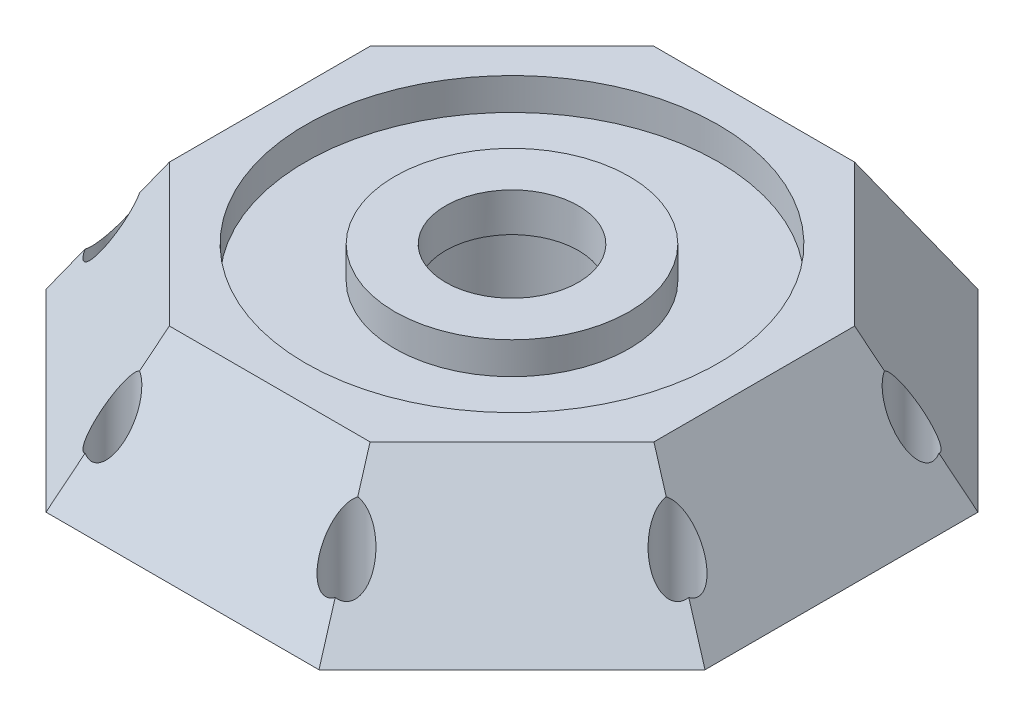
ISO-10303-21;
HEADER;
FILE_DESCRIPTION(('STEP AP214'),'2;1');
FILE_NAME('part.step','',(''),(''),'','','');
FILE_SCHEMA(('AUTOMOTIVE_DESIGN { 1 0 10303 214 1 1 1 1 }'));
ENDSEC;
DATA;
#1=APPLICATION_CONTEXT('core data for automotive mechanical design processes');
#2=APPLICATION_PROTOCOL_DEFINITION('international standard','automotive_design',2000,#1);
#3=PRODUCT_CONTEXT('',#1,'mechanical');
#4=PRODUCT('Part','Part','',(#3));
#5=PRODUCT_RELATED_PRODUCT_CATEGORY('part','',(#4));
#6=PRODUCT_DEFINITION_FORMATION('','',#4);
#7=PRODUCT_DEFINITION_CONTEXT('part definition',#1,'design');
#8=PRODUCT_DEFINITION('design','',#6,#7);
#9=PRODUCT_DEFINITION_SHAPE('','',#8);
#10=(LENGTH_UNIT() NAMED_UNIT(*) SI_UNIT(.MILLI.,.METRE.));
#11=(NAMED_UNIT(*) PLANE_ANGLE_UNIT() SI_UNIT($,.RADIAN.));
#12=(NAMED_UNIT(*) SI_UNIT($,.STERADIAN.) SOLID_ANGLE_UNIT());
#13=UNCERTAINTY_MEASURE_WITH_UNIT(LENGTH_MEASURE(1.E-05),#10,'distance_accuracy_value','');
#14=(GEOMETRIC_REPRESENTATION_CONTEXT(3) GLOBAL_UNCERTAINTY_ASSIGNED_CONTEXT((#13)) GLOBAL_UNIT_ASSIGNED_CONTEXT((#10,
#11,#12)) REPRESENTATION_CONTEXT('',''));
#15=CARTESIAN_POINT('',(0.,0.,0.));
#16=DIRECTION('',(0.,0.,1.));
#17=DIRECTION('',(1.,0.,0.));
#18=AXIS2_PLACEMENT_3D('',#15,#16,#17);
#19=CARTESIAN_POINT('',(0.,-0.00010000000000808,0.));
#20=DIRECTION('',(0.,1.,0.));
#21=DIRECTION('',(0.,0.,1.));
#22=AXIS2_PLACEMENT_3D('',#19,#20,#21);
#23=CYLINDRICAL_SURFACE('',#22,6.85);
#24=CARTESIAN_POINT('',(0.,14.,0.));
#25=DIRECTION('',(0.,1.,0.));
#26=DIRECTION('',(0.,0.,1.));
#27=AXIS2_PLACEMENT_3D('',#24,#25,#26);
#28=CIRCLE('',#27,6.85);
#29=CARTESIAN_POINT('',(0.,14.,6.85));
#30=VERTEX_POINT('',#29);
#31=EDGE_CURVE('E175',#30,#30,#28,.T.);
#32=ORIENTED_EDGE('',*,*,#31,.T.);
#33=EDGE_LOOP('',(#32));
#34=FACE_BOUND('',#33,.T.);
#35=CARTESIAN_POINT('',(0.,10.,0.));
#36=DIRECTION('',(0.,-1.,0.));
#37=DIRECTION('',(0.,0.,-1.));
#38=AXIS2_PLACEMENT_3D('',#35,#36,#37);
#39=CIRCLE('',#38,6.85);
#40=CARTESIAN_POINT('',(0.,10.,-6.85));
#41=VERTEX_POINT('',#40);
#42=EDGE_CURVE('E60',#41,#41,#39,.F.);
#43=ORIENTED_EDGE('',*,*,#42,.F.);
#44=EDGE_LOOP('',(#43));
#45=FACE_BOUND('',#44,.T.);
#46=ADVANCED_FACE('F55',(#34,#45),#23,.F.);
#47=CARTESIAN_POINT('',(0.,14.,0.));
#48=DIRECTION('',(0.,1.,0.));
#49=DIRECTION('',(0.,0.,1.));
#50=AXIS2_PLACEMENT_3D('',#47,#48,#49);
#51=PLANE('',#50);
#52=ORIENTED_EDGE('',*,*,#31,.F.);
#53=EDGE_LOOP('',(#52));
#54=FACE_BOUND('',#53,.T.);
#55=CARTESIAN_POINT('',(0.,14.,0.));
#56=DIRECTION('',(0.,1.,0.));
#57=DIRECTION('',(0.,0.,1.));
#58=AXIS2_PLACEMENT_3D('',#55,#56,#57);
#59=CIRCLE('',#58,12.1);
#60=CARTESIAN_POINT('',(0.,14.,12.1));
#61=VERTEX_POINT('',#60);
#62=EDGE_CURVE('E673',#61,#61,#59,.T.);
#63=ORIENTED_EDGE('',*,*,#62,.T.);
#64=EDGE_LOOP('',(#63));
#65=FACE_BOUND('',#64,.T.);
#66=ADVANCED_FACE('F386',(#54,#65),#51,.T.);
#67=CARTESIAN_POINT('',(0.,0.,0.));
#68=DIRECTION('',(0.,1.,0.));
#69=DIRECTION('',(0.,0.,1.));
#70=AXIS2_PLACEMENT_3D('',#67,#68,#69);
#71=PLANE('',#70);
#72=CARTESIAN_POINT('',(0.,0.,0.));
#73=DIRECTION('',(0.,-1.,0.));
#74=DIRECTION('',(0.,0.,-1.));
#75=AXIS2_PLACEMENT_3D('',#72,#73,#74);
#76=CIRCLE('',#75,7.85);
#77=CARTESIAN_POINT('',(0.,0.,-7.85));
#78=VERTEX_POINT('',#77);
#79=EDGE_CURVE('E679',#78,#78,#76,.T.);
#80=ORIENTED_EDGE('',*,*,#79,.F.);
#81=EDGE_LOOP('',(#80));
#82=FACE_BOUND('',#81,.T.);
#83=CARTESIAN_POINT('',(-29.1574578963008,0.,-12.0774145049703));
#84=DIRECTION('',(0.,1.,0.));
#85=DIRECTION('',(0.,0.,1.));
#86=AXIS2_PLACEMENT_3D('',#83,#84,#85);
#87=CIRCLE('',#86,2.15);
#88=CARTESIAN_POINT('',(-29.1574578963008,0.,-9.92741450497027));
#89=VERTEX_POINT('',#88);
#90=EDGE_CURVE('E523',#89,#89,#87,.T.);
#91=ORIENTED_EDGE('',*,*,#90,.T.);
#92=EDGE_LOOP('',(#91));
#93=FACE_BOUND('',#92,.T.);
#94=CARTESIAN_POINT('',(29.1574578963008,0.,-12.0774145049753));
#95=DIRECTION('',(0.,1.,0.));
#96=DIRECTION('',(0.,0.,1.));
#97=AXIS2_PLACEMENT_3D('',#94,#95,#96);
#98=CIRCLE('',#97,2.15000000000449);
#99=CARTESIAN_POINT('',(29.1574578963008,0.,-9.92741450497076));
#100=VERTEX_POINT('',#99);
#101=EDGE_CURVE('E524',#100,#100,#98,.T.);
#102=ORIENTED_EDGE('',*,*,#101,.T.);
#103=EDGE_LOOP('',(#102));
#104=FACE_BOUND('',#103,.T.);
#105=CARTESIAN_POINT('',(29.1574578963029,0.,12.0774145049653));
#106=DIRECTION('',(0.,1.,0.));
#107=DIRECTION('',(0.,0.,1.));
#108=AXIS2_PLACEMENT_3D('',#105,#106,#107);
#109=CIRCLE('',#108,2.15000000000358);
#110=CARTESIAN_POINT('',(29.1574578963029,0.,14.2274145049689));
#111=VERTEX_POINT('',#110);
#112=EDGE_CURVE('E570',#111,#111,#109,.T.);
#113=ORIENTED_EDGE('',*,*,#112,.T.);
#114=EDGE_LOOP('',(#113));
#115=FACE_BOUND('',#114,.T.);
#116=CARTESIAN_POINT('',(12.0774145049738,0.,29.1574578962973));
#117=DIRECTION('',(0.,1.,0.));
#118=DIRECTION('',(0.,0.,1.));
#119=AXIS2_PLACEMENT_3D('',#116,#117,#118);
#120=CIRCLE('',#119,2.15000000000166);
#121=CARTESIAN_POINT('',(12.0774145049738,0.,31.3074578962989));
#122=VERTEX_POINT('',#121);
#123=EDGE_CURVE('E574',#122,#122,#120,.T.);
#124=ORIENTED_EDGE('',*,*,#123,.T.);
#125=EDGE_LOOP('',(#124));
#126=FACE_BOUND('',#125,.T.);
#127=CARTESIAN_POINT('',(-12.0774145049667,0.,29.1574578962993));
#128=DIRECTION('',(0.,1.,0.));
#129=DIRECTION('',(0.,0.,1.));
#130=AXIS2_PLACEMENT_3D('',#127,#128,#129);
#131=CIRCLE('',#130,2.14999999999987);
#132=CARTESIAN_POINT('',(-12.0774145049667,0.,31.3074578962992));
#133=VERTEX_POINT('',#132);
#134=EDGE_CURVE('E578',#133,#133,#131,.T.);
#135=ORIENTED_EDGE('',*,*,#134,.T.);
#136=EDGE_LOOP('',(#135));
#137=FACE_BOUND('',#136,.T.);
#138=CARTESIAN_POINT('',(-29.1574578962987,0.,12.0774145049703));
#139=DIRECTION('',(0.,1.,0.));
#140=DIRECTION('',(0.,0.,1.));
#141=AXIS2_PLACEMENT_3D('',#138,#139,#140);
#142=CIRCLE('',#141,2.14999999999929);
#143=CARTESIAN_POINT('',(-29.1574578962987,0.,14.2274145049696));
#144=VERTEX_POINT('',#143);
#145=EDGE_CURVE('E174',#144,#144,#142,.T.);
#146=ORIENTED_EDGE('',*,*,#145,.T.);
#147=EDGE_LOOP('',(#146));
#148=FACE_BOUND('',#147,.T.);
#149=DIRECTION('',(0.707106781186547,0.,-0.707106781186548));
#150=VECTOR('',#149,1.);
#151=CARTESIAN_POINT('',(14.0832611206852,0.,34.));
#152=LINE('',#151,#150);
#153=CARTESIAN_POINT('',(14.0832611206852,0.,34.));
#154=VERTEX_POINT('',#153);
#155=CARTESIAN_POINT('',(34.,0.,14.0832611206852));
#156=VERTEX_POINT('',#155);
#157=EDGE_CURVE('E183',#154,#156,#152,.T.);
#158=ORIENTED_EDGE('',*,*,#157,.F.);
#159=DIRECTION('',(1.,0.,0.));
#160=VECTOR('',#159,1.);
#161=CARTESIAN_POINT('',(-14.0832611206852,0.,34.));
#162=LINE('',#161,#160);
#163=CARTESIAN_POINT('',(-14.0832611206852,0.,34.));
#164=VERTEX_POINT('',#163);
#165=EDGE_CURVE('E165',#164,#154,#162,.T.);
#166=ORIENTED_EDGE('',*,*,#165,.F.);
#167=DIRECTION('',(0.707106781186548,0.,0.707106781186547));
#168=VECTOR('',#167,1.);
#169=CARTESIAN_POINT('',(-34.,0.,14.0832611206853));
#170=LINE('',#169,#168);
#171=CARTESIAN_POINT('',(-34.,0.,14.0832611206853));
#172=VERTEX_POINT('',#171);
#173=EDGE_CURVE('E248',#172,#164,#170,.T.);
#174=ORIENTED_EDGE('',*,*,#173,.F.);
#175=DIRECTION('',(0.,0.,1.));
#176=VECTOR('',#175,1.);
#177=CARTESIAN_POINT('',(-34.,0.,-14.0832611206852));
#178=LINE('',#177,#176);
#179=CARTESIAN_POINT('',(-34.,0.,-14.0832611206852));
#180=VERTEX_POINT('',#179);
#181=EDGE_CURVE('E259',#180,#172,#178,.T.);
#182=ORIENTED_EDGE('',*,*,#181,.F.);
#183=DIRECTION('',(-0.707106781186547,0.,0.707106781186548));
#184=VECTOR('',#183,1.);
#185=CARTESIAN_POINT('',(-14.0832611206852,0.,-34.));
#186=LINE('',#185,#184);
#187=CARTESIAN_POINT('',(-14.0832611206852,0.,-34.));
#188=VERTEX_POINT('',#187);
#189=EDGE_CURVE('E504',#188,#180,#186,.T.);
#190=ORIENTED_EDGE('',*,*,#189,.F.);
#191=DIRECTION('',(-1.,0.,0.));
#192=VECTOR('',#191,1.);
#193=CARTESIAN_POINT('',(14.0832611206852,0.,-34.));
#194=LINE('',#193,#192);
#195=CARTESIAN_POINT('',(14.0832611206852,0.,-34.));
#196=VERTEX_POINT('',#195);
#197=EDGE_CURVE('E478',#196,#188,#194,.T.);
#198=ORIENTED_EDGE('',*,*,#197,.F.);
#199=DIRECTION('',(-0.707106781186548,0.,-0.707106781186547));
#200=VECTOR('',#199,1.);
#201=CARTESIAN_POINT('',(34.,0.,-14.0832611206853));
#202=LINE('',#201,#200);
#203=CARTESIAN_POINT('',(34.,0.,-14.0832611206853));
#204=VERTEX_POINT('',#203);
#205=EDGE_CURVE('E455',#204,#196,#202,.T.);
#206=ORIENTED_EDGE('',*,*,#205,.F.);
#207=DIRECTION('',(0.,0.,-1.));
#208=VECTOR('',#207,1.);
#209=CARTESIAN_POINT('',(34.,0.,14.0832611206852));
#210=LINE('',#209,#208);
#211=EDGE_CURVE('E186',#156,#204,#210,.T.);
#212=ORIENTED_EDGE('',*,*,#211,.F.);
#213=EDGE_LOOP('',(#158,#166,#174,#182,#190,#198,#206,#212));
#214=FACE_BOUND('',#213,.T.);
#215=ADVANCED_FACE('F57',(#82,#93,#104,#115,#126,#137,#148,#214),#71,.F.);
#216=CARTESIAN_POINT('',(0.,14.,0.));
#217=DIRECTION('',(0.,1.,0.));
#218=DIRECTION('',(0.,0.,1.));
#219=AXIS2_PLACEMENT_3D('',#216,#217,#218);
#220=CIRCLE('',#219,21.3);
#221=CARTESIAN_POINT('',(0.,14.,21.3));
#222=VERTEX_POINT('',#221);
#223=EDGE_CURVE('E687',#222,#222,#220,.T.);
#224=ORIENTED_EDGE('',*,*,#223,.F.);
#225=EDGE_LOOP('',(#224));
#226=FACE_BOUND('',#225,.T.);
#227=DIRECTION('',(0.,0.,-1.));
#228=VECTOR('',#227,1.);
#229=CARTESIAN_POINT('',(25.,14.,10.3553390593274));
#230=LINE('',#229,#228);
#231=CARTESIAN_POINT('',(25.,14.,10.3553390593274));
#232=VERTEX_POINT('',#231);
#233=CARTESIAN_POINT('',(25.,14.,-10.3553390593274));
#234=VERTEX_POINT('',#233);
#235=EDGE_CURVE('E319',#232,#234,#230,.T.);
#236=ORIENTED_EDGE('',*,*,#235,.T.);
#237=DIRECTION('',(-0.707106781186548,0.,-0.707106781186547));
#238=VECTOR('',#237,1.);
#239=CARTESIAN_POINT('',(25.,14.,-10.3553390593274));
#240=LINE('',#239,#238);
#241=CARTESIAN_POINT('',(10.3553390593274,14.,-25.));
#242=VERTEX_POINT('',#241);
#243=EDGE_CURVE('E426',#234,#242,#240,.T.);
#244=ORIENTED_EDGE('',*,*,#243,.T.);
#245=DIRECTION('',(-1.,0.,0.));
#246=VECTOR('',#245,1.);
#247=CARTESIAN_POINT('',(10.3553390593274,14.,-25.));
#248=LINE('',#247,#246);
#249=CARTESIAN_POINT('',(-10.3553390593274,14.,-25.));
#250=VERTEX_POINT('',#249);
#251=EDGE_CURVE('E433',#242,#250,#248,.T.);
#252=ORIENTED_EDGE('',*,*,#251,.T.);
#253=DIRECTION('',(-0.707106781186547,0.,0.707106781186548));
#254=VECTOR('',#253,1.);
#255=CARTESIAN_POINT('',(-10.3553390593274,14.,-25.));
#256=LINE('',#255,#254);
#257=CARTESIAN_POINT('',(-25.,14.,-10.3553390593274));
#258=VERTEX_POINT('',#257);
#259=EDGE_CURVE('E437',#250,#258,#256,.T.);
#260=ORIENTED_EDGE('',*,*,#259,.T.);
#261=DIRECTION('',(0.,0.,1.));
#262=VECTOR('',#261,1.);
#263=CARTESIAN_POINT('',(-25.,14.,-10.3553390593274));
#264=LINE('',#263,#262);
#265=CARTESIAN_POINT('',(-25.,14.,10.3553390593274));
#266=VERTEX_POINT('',#265);
#267=EDGE_CURVE('E518',#258,#266,#264,.T.);
#268=ORIENTED_EDGE('',*,*,#267,.T.);
#269=DIRECTION('',(0.707106781186548,0.,0.707106781186547));
#270=VECTOR('',#269,1.);
#271=CARTESIAN_POINT('',(-25.,14.,10.3553390593274));
#272=LINE('',#271,#270);
#273=CARTESIAN_POINT('',(-10.3553390593274,14.,25.));
#274=VERTEX_POINT('',#273);
#275=EDGE_CURVE('E181',#266,#274,#272,.T.);
#276=ORIENTED_EDGE('',*,*,#275,.T.);
#277=DIRECTION('',(1.,0.,0.));
#278=VECTOR('',#277,1.);
#279=CARTESIAN_POINT('',(-10.3553390593274,14.,25.));
#280=LINE('',#279,#278);
#281=CARTESIAN_POINT('',(10.3553390593274,14.,25.));
#282=VERTEX_POINT('',#281);
#283=EDGE_CURVE('E366',#274,#282,#280,.T.);
#284=ORIENTED_EDGE('',*,*,#283,.T.);
#285=DIRECTION('',(0.707106781186547,0.,-0.707106781186548));
#286=VECTOR('',#285,1.);
#287=CARTESIAN_POINT('',(10.3553390593274,14.,25.));
#288=LINE('',#287,#286);
#289=EDGE_CURVE('E363',#282,#232,#288,.T.);
#290=ORIENTED_EDGE('',*,*,#289,.T.);
#291=EDGE_LOOP('',(#236,#244,#252,#260,#268,#276,#284,#290));
#292=FACE_BOUND('',#291,.T.);
#293=ADVANCED_FACE('F376',(#226,#292),#51,.T.);
#294=CARTESIAN_POINT('',(-17.0114064614698,15.4657039711192,-17.0114064614698));
#295=DIRECTION('',(-0.594803004126922,0.5407575913135,-0.594803004126922));
#296=DIRECTION('',(-0.707106781186547,0.,0.707106781186548));
#297=AXIS2_PLACEMENT_3D('',#294,#295,#296);
#298=PLANE('',#297);
#299=CARTESIAN_POINT('',(-29.1574578963008,7.53284327242102,-12.0774145049703));
#300=DIRECTION('',(-0.594803004126922,0.5407575913135,-0.594803004126922));
#301=DIRECTION('',(0.38237335979588,0.841178475376553,0.382373359795879));
#302=AXIS2_PLACEMENT_3D('',#299,#300,#301);
#303=ELLIPSE('',#302,3.97590350008337,2.15);
#304=CARTESIAN_POINT('',(-27.1711169014015,10.6227070422643,-11.2546451253853));
#305=VERTEX_POINT('',#304);
#306=CARTESIAN_POINT('',(-31.1437988912,4.44297950257774,-12.9001838845552));
#307=VERTEX_POINT('',#306);
#308=EDGE_CURVE('E70',#305,#307,#303,.T.);
#309=ORIENTED_EDGE('',*,*,#308,.F.);
#310=DIRECTION('',(-0.52768237357817,-0.820839247788262,-0.218573195761303));
#311=VECTOR('',#310,1.);
#312=CARTESIAN_POINT('',(-25.,14.,-10.3553390593274));
#313=LINE('',#312,#311);
#314=EDGE_CURVE('E285',#258,#305,#313,.T.);
#315=ORIENTED_EDGE('',*,*,#314,.F.);
#316=ORIENTED_EDGE('',*,*,#259,.F.);
#317=DIRECTION('',(-0.218573195761305,-0.820839247788262,-0.52768237357817));
#318=VECTOR('',#317,1.);
#319=CARTESIAN_POINT('',(-10.3553390593274,14.,-25.));
#320=LINE('',#319,#318);
#321=EDGE_CURVE('E301',#250,#188,#320,.T.);
#322=ORIENTED_EDGE('',*,*,#321,.T.);
#323=ORIENTED_EDGE('',*,*,#189,.T.);
#324=EDGE_CURVE('E294',#307,#180,#313,.T.);
#325=ORIENTED_EDGE('',*,*,#324,.F.);
#326=EDGE_LOOP('',(#309,#315,#316,#322,#323,#325));
#327=FACE_BOUND('',#326,.T.);
#328=ADVANCED_FACE('F276',(#327),#298,.T.);
#329=CARTESIAN_POINT('',(-24.057761732852,15.4657039711192,0.));
#330=DIRECTION('',(-0.841178475376553,0.5407575913135,0.));
#331=DIRECTION('',(-0.5407575913135,-0.841178475376553,0.));
#332=AXIS2_PLACEMENT_3D('',#329,#330,#331);
#333=PLANE('',#332);
#334=CARTESIAN_POINT('',(-29.1574578963008,7.53284327242103,-12.0774145049703));
#335=DIRECTION('',(-0.841178475376553,0.5407575913135,0.));
#336=DIRECTION('',(0.5407575913135,0.841178475376553,0.));
#337=AXIS2_PLACEMENT_3D('',#334,#335,#336);
#338=ELLIPSE('',#337,3.97590350008337,2.15);
#339=EDGE_CURVE('E12',#307,#305,#338,.T.);
#340=ORIENTED_EDGE('',*,*,#339,.F.);
#341=ORIENTED_EDGE('',*,*,#324,.T.);
#342=ORIENTED_EDGE('',*,*,#181,.T.);
#343=DIRECTION('',(-0.52768237357817,-0.820839247788262,0.218573195761304));
#344=VECTOR('',#343,1.);
#345=CARTESIAN_POINT('',(-25.,14.,10.3553390593274));
#346=LINE('',#345,#344);
#347=CARTESIAN_POINT('',(-31.1437988911976,4.44297950258147,12.9001838845542));
#348=VERTEX_POINT('',#347);
#349=EDGE_CURVE('E173',#348,#172,#346,.T.);
#350=ORIENTED_EDGE('',*,*,#349,.F.);
#351=CARTESIAN_POINT('',(-29.1574578962987,7.53284327242423,12.0774145049703));
#352=DIRECTION('',(-0.841178475376553,0.5407575913135,0.));
#353=DIRECTION('',(0.5407575913135,0.841178475376553,0.));
#354=AXIS2_PLACEMENT_3D('',#351,#352,#353);
#355=ELLIPSE('',#354,3.97590350008207,2.14999999999929);
#356=CARTESIAN_POINT('',(-27.1711169014004,10.622707042266,11.2546451253849));
#357=VERTEX_POINT('',#356);
#358=EDGE_CURVE('E160',#357,#348,#355,.T.);
#359=ORIENTED_EDGE('',*,*,#358,.F.);
#360=EDGE_CURVE('E170',#266,#357,#346,.T.);
#361=ORIENTED_EDGE('',*,*,#360,.F.);
#362=ORIENTED_EDGE('',*,*,#267,.F.);
#363=ORIENTED_EDGE('',*,*,#314,.T.);
#364=EDGE_LOOP('',(#340,#341,#342,#350,#359,#361,#362,#363));
#365=FACE_BOUND('',#364,.T.);
#366=ADVANCED_FACE('F169',(#365),#333,.T.);
#367=CARTESIAN_POINT('',(0.,15.4657039711191,-24.057761732852));
#368=DIRECTION('',(0.,0.540757591313499,-0.841178475376553));
#369=DIRECTION('',(0.,0.841178475376553,0.540757591313499));
#370=AXIS2_PLACEMENT_3D('',#367,#368,#369);
#371=PLANE('',#370);
#372=DIRECTION('',(0.218573195761303,-0.820839247788262,-0.52768237357817));
#373=VECTOR('',#372,1.);
#374=CARTESIAN_POINT('',(10.3553390593274,14.,-25.));
#375=LINE('',#374,#373);
#376=EDGE_CURVE('E293',#242,#196,#375,.T.);
#377=ORIENTED_EDGE('',*,*,#376,.T.);
#378=ORIENTED_EDGE('',*,*,#197,.T.);
#379=ORIENTED_EDGE('',*,*,#321,.F.);
#380=ORIENTED_EDGE('',*,*,#251,.F.);
#381=EDGE_LOOP('',(#377,#378,#379,#380));
#382=FACE_BOUND('',#381,.T.);
#383=ADVANCED_FACE('F275',(#382),#371,.T.);
#384=CARTESIAN_POINT('',(17.0114064614698,15.4657039711191,-17.0114064614699));
#385=DIRECTION('',(0.594803004126922,0.540757591313499,-0.594803004126922));
#386=DIRECTION('',(-0.707106781186548,0.,-0.707106781186547));
#387=AXIS2_PLACEMENT_3D('',#384,#385,#386);
#388=PLANE('',#387);
#389=CARTESIAN_POINT('',(29.1574578963008,7.53284327241552,-12.0774145049753));
#390=DIRECTION('',(0.594803004126922,0.540757591313499,-0.594803004126922));
#391=DIRECTION('',(-0.382373359795879,0.841178475376553,0.382373359795879));
#392=AXIS2_PLACEMENT_3D('',#389,#390,#391);
#393=ELLIPSE('',#392,3.97590350009169,2.15000000000449);
#394=CARTESIAN_POINT('',(31.143798891206,4.4429795025685,-12.9001838845577));
#395=VERTEX_POINT('',#394);
#396=CARTESIAN_POINT('',(27.1711169013991,10.622707042268,-11.2546451253844));
#397=VERTEX_POINT('',#396);
#398=EDGE_CURVE('E77',#395,#397,#393,.T.);
#399=ORIENTED_EDGE('',*,*,#398,.F.);
#400=DIRECTION('',(0.527682373578168,-0.820839247788262,-0.218573195761305));
#401=VECTOR('',#400,1.);
#402=CARTESIAN_POINT('',(25.,14.,-10.3553390593274));
#403=LINE('',#402,#401);
#404=EDGE_CURVE('E304',#395,#204,#403,.T.);
#405=ORIENTED_EDGE('',*,*,#404,.T.);
#406=ORIENTED_EDGE('',*,*,#205,.T.);
#407=ORIENTED_EDGE('',*,*,#376,.F.);
#408=ORIENTED_EDGE('',*,*,#243,.F.);
#409=EDGE_CURVE('E307',#234,#397,#403,.T.);
#410=ORIENTED_EDGE('',*,*,#409,.T.);
#411=EDGE_LOOP('',(#399,#405,#406,#407,#408,#410));
#412=FACE_BOUND('',#411,.T.);
#413=ADVANCED_FACE('F331',(#412),#388,.T.);
#414=CARTESIAN_POINT('',(24.057761732852,15.4657039711191,0.));
#415=DIRECTION('',(0.841178475376553,0.540757591313499,0.));
#416=DIRECTION('',(-0.540757591313499,0.841178475376553,0.));
#417=AXIS2_PLACEMENT_3D('',#414,#415,#416);
#418=PLANE('',#417);
#419=CARTESIAN_POINT('',(29.1574578963008,7.53284327242098,-12.0774145049753));
#420=DIRECTION('',(0.841178475376553,0.540757591313499,0.));
#421=DIRECTION('',(-0.540757591313499,0.841178475376553,0.));
#422=AXIS2_PLACEMENT_3D('',#419,#420,#421);
#423=ELLIPSE('',#422,3.9759035000917,2.15000000000449);
#424=EDGE_CURVE('E65',#397,#395,#423,.T.);
#425=ORIENTED_EDGE('',*,*,#424,.F.);
#426=ORIENTED_EDGE('',*,*,#409,.F.);
#427=ORIENTED_EDGE('',*,*,#235,.F.);
#428=DIRECTION('',(0.527682373578169,-0.820839247788262,0.218573195761303));
#429=VECTOR('',#428,1.);
#430=CARTESIAN_POINT('',(25.,14.,10.3553390593274));
#431=LINE('',#430,#429);
#432=CARTESIAN_POINT('',(27.1711169013982,10.6227070422694,11.254645125384));
#433=VERTEX_POINT('',#432);
#434=EDGE_CURVE('E547',#232,#433,#431,.T.);
#435=ORIENTED_EDGE('',*,*,#434,.T.);
#436=CARTESIAN_POINT('',(29.1574578963029,7.53284327241779,12.0774145049653));
#437=DIRECTION('',(0.841178475376553,0.540757591313499,0.));
#438=DIRECTION('',(-0.540757591313499,0.841178475376553,0.));
#439=AXIS2_PLACEMENT_3D('',#436,#437,#438);
#440=ELLIPSE('',#439,3.97590350009,2.15000000000358);
#441=CARTESIAN_POINT('',(31.1437988912034,4.44297950257255,12.9001838845566));
#442=VERTEX_POINT('',#441);
#443=EDGE_CURVE('E646',#442,#433,#440,.T.);
#444=ORIENTED_EDGE('',*,*,#443,.F.);
#445=EDGE_CURVE('E552',#442,#156,#431,.T.);
#446=ORIENTED_EDGE('',*,*,#445,.T.);
#447=ORIENTED_EDGE('',*,*,#211,.T.);
#448=ORIENTED_EDGE('',*,*,#404,.F.);
#449=EDGE_LOOP('',(#425,#426,#427,#435,#444,#446,#447,#448));
#450=FACE_BOUND('',#449,.T.);
#451=ADVANCED_FACE('F323',(#450),#418,.T.);
#452=CARTESIAN_POINT('',(17.0114064614699,15.4657039711191,17.0114064614699));
#453=DIRECTION('',(0.594803004126922,0.540757591313499,0.594803004126922));
#454=DIRECTION('',(0.707106781186548,0.,-0.707106781186548));
#455=AXIS2_PLACEMENT_3D('',#452,#453,#454);
#456=PLANE('',#455);
#457=CARTESIAN_POINT('',(29.1574578963029,7.5328432724242,12.0774145049653));
#458=DIRECTION('',(0.594803004126922,0.540757591313499,0.594803004126922));
#459=DIRECTION('',(-0.382373359795879,0.841178475376554,-0.382373359795879));
#460=AXIS2_PLACEMENT_3D('',#457,#458,#459);
#461=ELLIPSE('',#460,3.97590350009001,2.15000000000358);
#462=EDGE_CURVE('E303',#433,#442,#461,.T.);
#463=ORIENTED_EDGE('',*,*,#462,.F.);
#464=ORIENTED_EDGE('',*,*,#434,.F.);
#465=ORIENTED_EDGE('',*,*,#289,.F.);
#466=DIRECTION('',(0.218573195761304,-0.820839247788263,0.527682373578168));
#467=VECTOR('',#466,1.);
#468=CARTESIAN_POINT('',(10.3553390593274,14.,25.));
#469=LINE('',#468,#467);
#470=CARTESIAN_POINT('',(11.254645125384,10.6227070422694,27.1711169013982));
#471=VERTEX_POINT('',#470);
#472=EDGE_CURVE('E205',#282,#471,#469,.T.);
#473=ORIENTED_EDGE('',*,*,#472,.T.);
#474=CARTESIAN_POINT('',(12.0774145049738,7.53284327242098,29.1574578962973));
#475=DIRECTION('',(0.594803004126922,0.540757591313499,0.594803004126922));
#476=DIRECTION('',(-0.382373359795879,0.841178475376554,-0.382373359795879));
#477=AXIS2_PLACEMENT_3D('',#474,#475,#476);
#478=ELLIPSE('',#477,3.97590350008645,2.15000000000166);
#479=CARTESIAN_POINT('',(12.9001838845551,4.44297950257804,31.1437988911998));
#480=VERTEX_POINT('',#479);
#481=EDGE_CURVE('E643',#480,#471,#478,.T.);
#482=ORIENTED_EDGE('',*,*,#481,.F.);
#483=EDGE_CURVE('E544',#480,#154,#469,.T.);
#484=ORIENTED_EDGE('',*,*,#483,.T.);
#485=ORIENTED_EDGE('',*,*,#157,.T.);
#486=ORIENTED_EDGE('',*,*,#445,.F.);
#487=EDGE_LOOP('',(#463,#464,#465,#473,#482,#484,#485,#486));
#488=FACE_BOUND('',#487,.T.);
#489=ADVANCED_FACE('F226',(#488),#456,.T.);
#490=CARTESIAN_POINT('',(0.,15.4657039711191,24.057761732852));
#491=DIRECTION('',(0.,0.540757591313498,0.841178475376554));
#492=DIRECTION('',(0.,-0.841178475376554,0.540757591313498));
#493=AXIS2_PLACEMENT_3D('',#490,#491,#492);
#494=PLANE('',#493);
#495=CARTESIAN_POINT('',(12.0774145049738,7.53284327242646,29.1574578962973));
#496=DIRECTION('',(0.,0.540757591313498,0.841178475376554));
#497=DIRECTION('',(0.,0.841178475376554,-0.540757591313498));
#498=AXIS2_PLACEMENT_3D('',#495,#496,#497);
#499=ELLIPSE('',#498,3.97590350008645,2.15000000000166);
#500=EDGE_CURVE('E551',#471,#480,#499,.T.);
#501=ORIENTED_EDGE('',*,*,#500,.F.);
#502=ORIENTED_EDGE('',*,*,#472,.F.);
#503=ORIENTED_EDGE('',*,*,#283,.F.);
#504=DIRECTION('',(-0.218573195761306,-0.820839247788262,0.527682373578168));
#505=VECTOR('',#504,1.);
#506=CARTESIAN_POINT('',(-10.3553390593274,14.,25.));
#507=LINE('',#506,#505);
#508=CARTESIAN_POINT('',(-11.2546451253843,10.622707042268,27.1711169013992));
#509=VERTEX_POINT('',#508);
#510=EDGE_CURVE('E188',#274,#509,#507,.T.);
#511=ORIENTED_EDGE('',*,*,#510,.T.);
#512=CARTESIAN_POINT('',(-12.0774145049667,7.53284327242326,29.1574578962993));
#513=DIRECTION('',(0.,0.540757591313498,0.841178475376554));
#514=DIRECTION('',(0.,0.841178475376554,-0.540757591313498));
#515=AXIS2_PLACEMENT_3D('',#512,#513,#514);
#516=ELLIPSE('',#515,3.97590350008314,2.14999999999987);
#517=CARTESIAN_POINT('',(-12.9001838845541,4.44297950258176,31.1437988911975));
#518=VERTEX_POINT('',#517);
#519=EDGE_CURVE('E639',#518,#509,#516,.T.);
#520=ORIENTED_EDGE('',*,*,#519,.F.);
#521=EDGE_CURVE('E203',#518,#164,#507,.T.);
#522=ORIENTED_EDGE('',*,*,#521,.T.);
#523=ORIENTED_EDGE('',*,*,#165,.T.);
#524=ORIENTED_EDGE('',*,*,#483,.F.);
#525=EDGE_LOOP('',(#501,#502,#503,#511,#520,#522,#523,#524));
#526=FACE_BOUND('',#525,.T.);
#527=ADVANCED_FACE('F217',(#526),#494,.T.);
#528=CARTESIAN_POINT('',(-17.0114064614698,15.4657039711192,17.0114064614698));
#529=DIRECTION('',(-0.594803004126922,0.5407575913135,0.594803004126922));
#530=DIRECTION('',(0.707106781186548,0.,0.707106781186547));
#531=AXIS2_PLACEMENT_3D('',#528,#529,#530);
#532=PLANE('',#531);
#533=CARTESIAN_POINT('',(-12.0774145049667,7.53284327242648,29.1574578962993));
#534=DIRECTION('',(-0.594803004126922,0.5407575913135,0.594803004126922));
#535=DIRECTION('',(0.382373359795879,0.841178475376553,-0.38237335979588));
#536=AXIS2_PLACEMENT_3D('',#533,#534,#535);
#537=ELLIPSE('',#536,3.97590350008313,2.14999999999987);
#538=EDGE_CURVE('E164',#509,#518,#537,.T.);
#539=ORIENTED_EDGE('',*,*,#538,.F.);
#540=ORIENTED_EDGE('',*,*,#510,.F.);
#541=ORIENTED_EDGE('',*,*,#275,.F.);
#542=ORIENTED_EDGE('',*,*,#360,.T.);
#543=CARTESIAN_POINT('',(-29.1574578962987,7.53284327242327,12.0774145049703));
#544=DIRECTION('',(-0.594803004126922,0.5407575913135,0.594803004126922));
#545=DIRECTION('',(0.382373359795879,0.841178475376553,-0.38237335979588));
#546=AXIS2_PLACEMENT_3D('',#543,#544,#545);
#547=ELLIPSE('',#546,3.97590350008207,2.14999999999929);
#548=EDGE_CURVE('E156',#348,#357,#547,.T.);
#549=ORIENTED_EDGE('',*,*,#548,.F.);
#550=ORIENTED_EDGE('',*,*,#349,.T.);
#551=ORIENTED_EDGE('',*,*,#173,.T.);
#552=ORIENTED_EDGE('',*,*,#521,.F.);
#553=EDGE_LOOP('',(#539,#540,#541,#542,#549,#550,#551,#552));
#554=FACE_BOUND('',#553,.T.);
#555=ADVANCED_FACE('F178',(#554),#532,.T.);
#556=CARTESIAN_POINT('',(-29.1574578962987,-0.00010000000000808,12.0774145049703));
#557=DIRECTION('',(0.,1.,0.));
#558=DIRECTION('',(0.,0.,1.));
#559=AXIS2_PLACEMENT_3D('',#556,#557,#558);
#560=CYLINDRICAL_SURFACE('',#559,2.14999999999929);
#561=ORIENTED_EDGE('',*,*,#358,.T.);
#562=ORIENTED_EDGE('',*,*,#548,.T.);
#563=EDGE_LOOP('',(#561,#562));
#564=FACE_BOUND('',#563,.T.);
#565=ORIENTED_EDGE('',*,*,#145,.F.);
#566=EDGE_LOOP('',(#565));
#567=FACE_BOUND('',#566,.T.);
#568=ADVANCED_FACE('F158',(#564,#567),#560,.F.);
#569=CARTESIAN_POINT('',(-12.0774145049667,-0.00010000000000808,29.1574578962993));
#570=DIRECTION('',(0.,1.,0.));
#571=DIRECTION('',(0.,0.,1.));
#572=AXIS2_PLACEMENT_3D('',#569,#570,#571);
#573=CYLINDRICAL_SURFACE('',#572,2.14999999999987);
#574=ORIENTED_EDGE('',*,*,#519,.T.);
#575=ORIENTED_EDGE('',*,*,#538,.T.);
#576=EDGE_LOOP('',(#574,#575));
#577=FACE_BOUND('',#576,.T.);
#578=ORIENTED_EDGE('',*,*,#134,.F.);
#579=EDGE_LOOP('',(#578));
#580=FACE_BOUND('',#579,.T.);
#581=ADVANCED_FACE('F660',(#577,#580),#573,.F.);
#582=CARTESIAN_POINT('',(12.0774145049738,-0.00010000000000808,29.1574578962973));
#583=DIRECTION('',(0.,1.,0.));
#584=DIRECTION('',(0.,0.,1.));
#585=AXIS2_PLACEMENT_3D('',#582,#583,#584);
#586=CYLINDRICAL_SURFACE('',#585,2.15000000000166);
#587=ORIENTED_EDGE('',*,*,#481,.T.);
#588=ORIENTED_EDGE('',*,*,#500,.T.);
#589=EDGE_LOOP('',(#587,#588));
#590=FACE_BOUND('',#589,.T.);
#591=ORIENTED_EDGE('',*,*,#123,.F.);
#592=EDGE_LOOP('',(#591));
#593=FACE_BOUND('',#592,.T.);
#594=ADVANCED_FACE('F655',(#590,#593),#586,.F.);
#595=CARTESIAN_POINT('',(29.1574578963029,-0.00010000000000808,12.0774145049653));
#596=DIRECTION('',(0.,1.,0.));
#597=DIRECTION('',(0.,0.,1.));
#598=AXIS2_PLACEMENT_3D('',#595,#596,#597);
#599=CYLINDRICAL_SURFACE('',#598,2.15000000000358);
#600=ORIENTED_EDGE('',*,*,#443,.T.);
#601=ORIENTED_EDGE('',*,*,#462,.T.);
#602=EDGE_LOOP('',(#600,#601));
#603=FACE_BOUND('',#602,.T.);
#604=ORIENTED_EDGE('',*,*,#112,.F.);
#605=EDGE_LOOP('',(#604));
#606=FACE_BOUND('',#605,.T.);
#607=ADVANCED_FACE('F560',(#603,#606),#599,.F.);
#608=CARTESIAN_POINT('',(29.1574578963008,-0.00010000000000808,-12.0774145049753));
#609=DIRECTION('',(0.,1.,0.));
#610=DIRECTION('',(0.,0.,1.));
#611=AXIS2_PLACEMENT_3D('',#608,#609,#610);
#612=CYLINDRICAL_SURFACE('',#611,2.15000000000449);
#613=ORIENTED_EDGE('',*,*,#398,.T.);
#614=ORIENTED_EDGE('',*,*,#424,.T.);
#615=EDGE_LOOP('',(#613,#614));
#616=FACE_BOUND('',#615,.T.);
#617=ORIENTED_EDGE('',*,*,#101,.F.);
#618=EDGE_LOOP('',(#617));
#619=FACE_BOUND('',#618,.T.);
#620=ADVANCED_FACE('F556',(#616,#619),#612,.F.);
#621=CARTESIAN_POINT('',(-29.1574578963008,-0.00010000000000808,-12.0774145049703));
#622=DIRECTION('',(0.,1.,0.));
#623=DIRECTION('',(0.,0.,1.));
#624=AXIS2_PLACEMENT_3D('',#621,#622,#623);
#625=CYLINDRICAL_SURFACE('',#624,2.15);
#626=ORIENTED_EDGE('',*,*,#308,.T.);
#627=ORIENTED_EDGE('',*,*,#339,.T.);
#628=EDGE_LOOP('',(#626,#627));
#629=FACE_BOUND('',#628,.T.);
#630=ORIENTED_EDGE('',*,*,#90,.F.);
#631=EDGE_LOOP('',(#630));
#632=FACE_BOUND('',#631,.T.);
#633=ADVANCED_FACE('F559',(#629,#632),#625,.F.);
#634=CARTESIAN_POINT('',(0.,10.7,0.));
#635=DIRECTION('',(0.,1.,0.));
#636=DIRECTION('',(0.,0.,1.));
#637=AXIS2_PLACEMENT_3D('',#634,#635,#636);
#638=CYLINDRICAL_SURFACE('',#637,21.3);
#639=CARTESIAN_POINT('',(0.,10.7,0.));
#640=DIRECTION('',(0.,1.,0.));
#641=DIRECTION('',(0.,0.,1.));
#642=AXIS2_PLACEMENT_3D('',#639,#640,#641);
#643=CIRCLE('',#642,21.3);
#644=CARTESIAN_POINT('',(0.,10.7,21.3));
#645=VERTEX_POINT('',#644);
#646=EDGE_CURVE('E689',#645,#645,#643,.T.);
#647=ORIENTED_EDGE('',*,*,#646,.F.);
#648=EDGE_LOOP('',(#647));
#649=FACE_BOUND('',#648,.T.);
#650=ORIENTED_EDGE('',*,*,#223,.T.);
#651=EDGE_LOOP('',(#650));
#652=FACE_BOUND('',#651,.T.);
#653=ADVANCED_FACE('F703',(#649,#652),#638,.F.);
#654=CARTESIAN_POINT('',(0.,10.7,0.));
#655=DIRECTION('',(0.,1.,0.));
#656=DIRECTION('',(0.,0.,1.));
#657=AXIS2_PLACEMENT_3D('',#654,#655,#656);
#658=PLANE('',#657);
#659=CARTESIAN_POINT('',(0.,10.7,0.));
#660=DIRECTION('',(0.,1.,0.));
#661=DIRECTION('',(0.,0.,1.));
#662=AXIS2_PLACEMENT_3D('',#659,#660,#661);
#663=CIRCLE('',#662,12.1);
#664=CARTESIAN_POINT('',(0.,10.7,12.1));
#665=VERTEX_POINT('',#664);
#666=EDGE_CURVE('E676',#665,#665,#663,.T.);
#667=ORIENTED_EDGE('',*,*,#666,.F.);
#668=EDGE_LOOP('',(#667));
#669=FACE_BOUND('',#668,.T.);
#670=ORIENTED_EDGE('',*,*,#646,.T.);
#671=EDGE_LOOP('',(#670));
#672=FACE_BOUND('',#671,.T.);
#673=ADVANCED_FACE('F710',(#669,#672),#658,.T.);
#674=CARTESIAN_POINT('',(0.,10.7,0.));
#675=DIRECTION('',(0.,1.,0.));
#676=DIRECTION('',(0.,0.,1.));
#677=AXIS2_PLACEMENT_3D('',#674,#675,#676);
#678=CYLINDRICAL_SURFACE('',#677,12.1);
#679=ORIENTED_EDGE('',*,*,#666,.T.);
#680=EDGE_LOOP('',(#679));
#681=FACE_BOUND('',#680,.T.);
#682=ORIENTED_EDGE('',*,*,#62,.F.);
#683=EDGE_LOOP('',(#682));
#684=FACE_BOUND('',#683,.T.);
#685=ADVANCED_FACE('F718',(#681,#684),#678,.T.);
#686=CARTESIAN_POINT('',(0.,10.,0.));
#687=DIRECTION('',(0.,-1.,0.));
#688=DIRECTION('',(0.,0.,-1.));
#689=AXIS2_PLACEMENT_3D('',#686,#687,#688);
#690=PLANE('',#689);
#691=CARTESIAN_POINT('',(0.,10.,0.));
#692=DIRECTION('',(0.,-1.,0.));
#693=DIRECTION('',(0.,0.,-1.));
#694=AXIS2_PLACEMENT_3D('',#691,#692,#693);
#695=CIRCLE('',#694,7.85);
#696=CARTESIAN_POINT('',(0.,10.,-7.85));
#697=VERTEX_POINT('',#696);
#698=EDGE_CURVE('E674',#697,#697,#695,.T.);
#699=ORIENTED_EDGE('',*,*,#698,.T.);
#700=EDGE_LOOP('',(#699));
#701=FACE_BOUND('',#700,.T.);
#702=ORIENTED_EDGE('',*,*,#42,.T.);
#703=EDGE_LOOP('',(#702));
#704=FACE_BOUND('',#703,.T.);
#705=ADVANCED_FACE('F727',(#701,#704),#690,.T.);
#706=CARTESIAN_POINT('',(0.,10.,0.));
#707=DIRECTION('',(0.,-1.,0.));
#708=DIRECTION('',(0.,0.,-1.));
#709=AXIS2_PLACEMENT_3D('',#706,#707,#708);
#710=CYLINDRICAL_SURFACE('',#709,7.85);
#711=ORIENTED_EDGE('',*,*,#698,.F.);
#712=EDGE_LOOP('',(#711));
#713=FACE_BOUND('',#712,.T.);
#714=ORIENTED_EDGE('',*,*,#79,.T.);
#715=EDGE_LOOP('',(#714));
#716=FACE_BOUND('',#715,.T.);
#717=ADVANCED_FACE('F732',(#713,#716),#710,.F.);
#718=CLOSED_SHELL('',(#46,#66,#215,#293,#328,#366,#383,#413,#451,#489,#527,#555,#568,#581,#594,
#607,#620,#633,#653,#673,#685,#705,#717));
#719=MANIFOLD_SOLID_BREP('B2',#718);
#720=ADVANCED_BREP_SHAPE_REPRESENTATION('',(#18,#719),#14);
#721=SHAPE_DEFINITION_REPRESENTATION(#9,#720);
ENDSEC;
END-ISO-10303-21;
